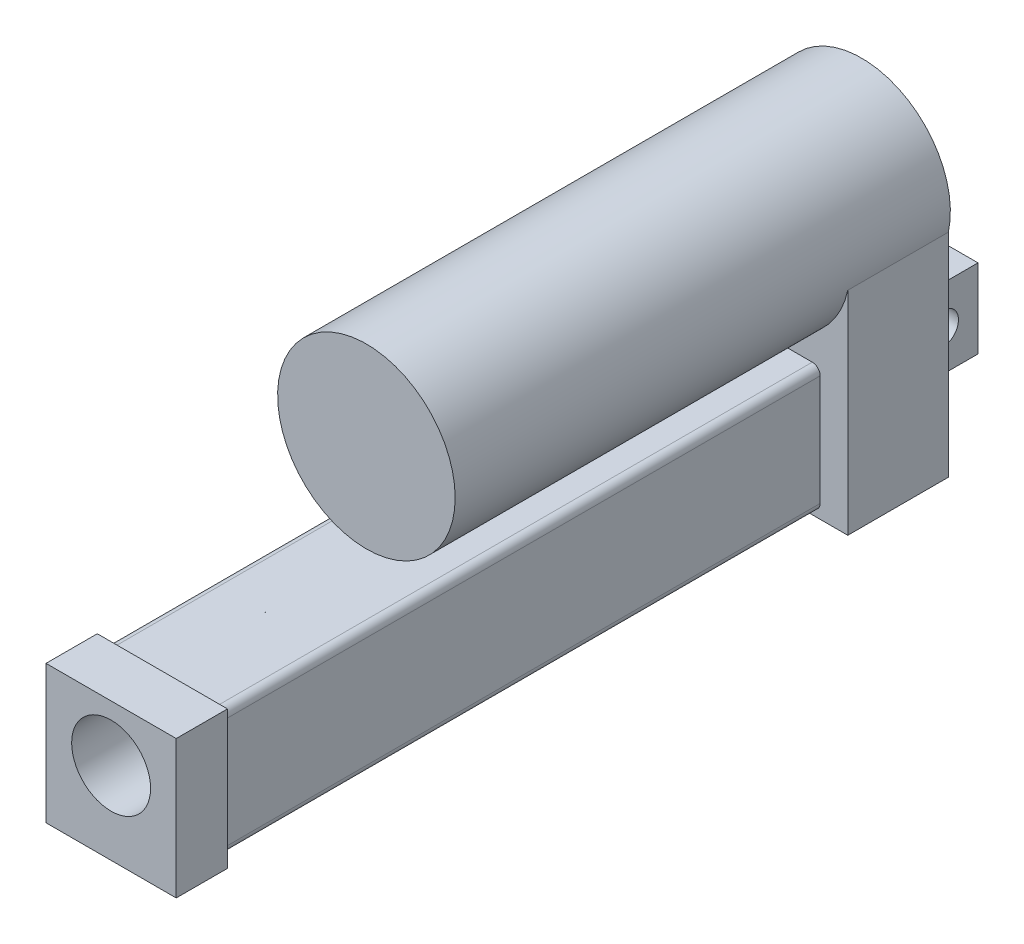
ISO-10303-21;
HEADER;
FILE_DESCRIPTION(('STEP AP214'),'2;1');
FILE_NAME('part.step','',(''),(''),'','','');
FILE_SCHEMA(('AUTOMOTIVE_DESIGN { 1 0 10303 214 1 1 1 1 }'));
ENDSEC;
DATA;
#1=APPLICATION_CONTEXT('core data for automotive mechanical design processes');
#2=APPLICATION_PROTOCOL_DEFINITION('international standard','automotive_design',2000,#1);
#3=PRODUCT_CONTEXT('',#1,'mechanical');
#4=PRODUCT('Part','Part','',(#3));
#5=PRODUCT_RELATED_PRODUCT_CATEGORY('part','',(#4));
#6=PRODUCT_DEFINITION_FORMATION('','',#4);
#7=PRODUCT_DEFINITION_CONTEXT('part definition',#1,'design');
#8=PRODUCT_DEFINITION('design','',#6,#7);
#9=PRODUCT_DEFINITION_SHAPE('','',#8);
#10=(LENGTH_UNIT() NAMED_UNIT(*) SI_UNIT(.MILLI.,.METRE.));
#11=(NAMED_UNIT(*) PLANE_ANGLE_UNIT() SI_UNIT($,.RADIAN.));
#12=(NAMED_UNIT(*) SI_UNIT($,.STERADIAN.) SOLID_ANGLE_UNIT());
#13=UNCERTAINTY_MEASURE_WITH_UNIT(LENGTH_MEASURE(1.E-05),#10,'distance_accuracy_value','');
#14=(GEOMETRIC_REPRESENTATION_CONTEXT(3) GLOBAL_UNCERTAINTY_ASSIGNED_CONTEXT((#13)) GLOBAL_UNIT_ASSIGNED_CONTEXT((#10,
#11,#12)) REPRESENTATION_CONTEXT('',''));
#15=CARTESIAN_POINT('',(0.,0.,0.));
#16=DIRECTION('',(0.,0.,1.));
#17=DIRECTION('',(1.,0.,0.));
#18=AXIS2_PLACEMENT_3D('',#15,#16,#17);
#19=CARTESIAN_POINT('',(15.,-57.,190.2));
#20=DIRECTION('',(-1.,0.,0.));
#21=DIRECTION('',(0.,-1.,0.));
#22=AXIS2_PLACEMENT_3D('',#19,#20,#21);
#23=PLANE('',#22);
#24=DIRECTION('',(0.,1.,0.));
#25=VECTOR('',#24,1.);
#26=CARTESIAN_POINT('',(15.,-57.,177.2));
#27=LINE('',#26,#25);
#28=CARTESIAN_POINT('',(15.,-55.,177.2));
#29=VERTEX_POINT('',#28);
#30=CARTESIAN_POINT('',(15.,-27.,177.2));
#31=VERTEX_POINT('',#30);
#32=EDGE_CURVE('E226',#29,#31,#27,.T.);
#33=ORIENTED_EDGE('',*,*,#32,.F.);
#34=DIRECTION('',(0.,0.,-1.));
#35=VECTOR('',#34,1.);
#36=CARTESIAN_POINT('',(15.,-55.,190.2));
#37=LINE('',#36,#35);
#38=CARTESIAN_POINT('',(15.,-55.,25.5));
#39=VERTEX_POINT('',#38);
#40=EDGE_CURVE('E327',#29,#39,#37,.T.);
#41=ORIENTED_EDGE('',*,*,#40,.T.);
#42=DIRECTION('',(0.,1.,0.));
#43=VECTOR('',#42,1.);
#44=CARTESIAN_POINT('',(15.,-57.,25.5));
#45=LINE('',#44,#43);
#46=CARTESIAN_POINT('',(15.,-27.,25.5));
#47=VERTEX_POINT('',#46);
#48=EDGE_CURVE('E268',#39,#47,#45,.T.);
#49=ORIENTED_EDGE('',*,*,#48,.T.);
#50=DIRECTION('',(0.,0.,-1.));
#51=VECTOR('',#50,1.);
#52=CARTESIAN_POINT('',(15.,-27.,190.2));
#53=LINE('',#52,#51);
#54=EDGE_CURVE('E325',#47,#31,#53,.F.);
#55=ORIENTED_EDGE('',*,*,#54,.T.);
#56=EDGE_LOOP('',(#33,#41,#49,#55));
#57=FACE_BOUND('',#56,.T.);
#58=ADVANCED_FACE('F37',(#57),#23,.F.);
#59=CARTESIAN_POINT('',(-15.,-25.,190.2));
#60=DIRECTION('',(0.,-1.,0.));
#61=DIRECTION('',(0.,0.,-1.));
#62=AXIS2_PLACEMENT_3D('',#59,#60,#61);
#63=PLANE('',#62);
#64=DIRECTION('',(-1.,0.,0.));
#65=VECTOR('',#64,1.);
#66=CARTESIAN_POINT('',(-15.,-25.,25.5));
#67=LINE('',#66,#65);
#68=CARTESIAN_POINT('',(13.,-25.,25.5));
#69=VERTEX_POINT('',#68);
#70=CARTESIAN_POINT('',(-13.,-25.,25.5));
#71=VERTEX_POINT('',#70);
#72=EDGE_CURVE('E271',#69,#71,#67,.T.);
#73=ORIENTED_EDGE('',*,*,#72,.T.);
#74=DIRECTION('',(0.,0.,-1.));
#75=VECTOR('',#74,1.);
#76=CARTESIAN_POINT('',(-13.,-25.,190.2));
#77=LINE('',#76,#75);
#78=CARTESIAN_POINT('',(-13.,-25.,177.2));
#79=VERTEX_POINT('',#78);
#80=EDGE_CURVE('E332',#71,#79,#77,.F.);
#81=ORIENTED_EDGE('',*,*,#80,.T.);
#82=DIRECTION('',(-1.,0.,0.));
#83=VECTOR('',#82,1.);
#84=CARTESIAN_POINT('',(-15.,-25.,177.2));
#85=LINE('',#84,#83);
#86=CARTESIAN_POINT('',(13.,-25.,177.2));
#87=VERTEX_POINT('',#86);
#88=EDGE_CURVE('E223',#87,#79,#85,.T.);
#89=ORIENTED_EDGE('',*,*,#88,.F.);
#90=DIRECTION('',(0.,0.,-1.));
#91=VECTOR('',#90,1.);
#92=CARTESIAN_POINT('',(13.,-25.,190.2));
#93=LINE('',#92,#91);
#94=EDGE_CURVE('E330',#87,#69,#93,.T.);
#95=ORIENTED_EDGE('',*,*,#94,.T.);
#96=EDGE_LOOP('',(#73,#81,#89,#95));
#97=FACE_BOUND('',#96,.T.);
#98=ADVANCED_FACE('F353',(#97),#63,.F.);
#99=CARTESIAN_POINT('',(-15.,-57.,190.2));
#100=DIRECTION('',(1.,0.,0.));
#101=DIRECTION('',(0.,0.,-1.));
#102=AXIS2_PLACEMENT_3D('',#99,#100,#101);
#103=PLANE('',#102);
#104=DIRECTION('',(0.,-1.,0.));
#105=VECTOR('',#104,1.);
#106=CARTESIAN_POINT('',(-15.,-57.,25.5));
#107=LINE('',#106,#105);
#108=CARTESIAN_POINT('',(-15.,-27.,25.5));
#109=VERTEX_POINT('',#108);
#110=CARTESIAN_POINT('',(-15.,-55.,25.5));
#111=VERTEX_POINT('',#110);
#112=EDGE_CURVE('E273',#109,#111,#107,.T.);
#113=ORIENTED_EDGE('',*,*,#112,.T.);
#114=DIRECTION('',(0.,0.,-1.));
#115=VECTOR('',#114,1.);
#116=CARTESIAN_POINT('',(-15.,-55.,190.2));
#117=LINE('',#116,#115);
#118=CARTESIAN_POINT('',(-15.,-55.,177.2));
#119=VERTEX_POINT('',#118);
#120=EDGE_CURVE('E323',#111,#119,#117,.F.);
#121=ORIENTED_EDGE('',*,*,#120,.T.);
#122=DIRECTION('',(0.,-1.,0.));
#123=VECTOR('',#122,1.);
#124=CARTESIAN_POINT('',(-15.,-57.,177.2));
#125=LINE('',#124,#123);
#126=CARTESIAN_POINT('',(-15.,-27.,177.2));
#127=VERTEX_POINT('',#126);
#128=EDGE_CURVE('E217',#127,#119,#125,.T.);
#129=ORIENTED_EDGE('',*,*,#128,.F.);
#130=DIRECTION('',(0.,0.,-1.));
#131=VECTOR('',#130,1.);
#132=CARTESIAN_POINT('',(-15.,-27.,190.2));
#133=LINE('',#132,#131);
#134=EDGE_CURVE('E320',#127,#109,#133,.T.);
#135=ORIENTED_EDGE('',*,*,#134,.T.);
#136=EDGE_LOOP('',(#113,#121,#129,#135));
#137=FACE_BOUND('',#136,.T.);
#138=ADVANCED_FACE('F361',(#137),#103,.F.);
#139=CARTESIAN_POINT('',(-15.,-57.,190.2));
#140=DIRECTION('',(0.,1.,0.));
#141=DIRECTION('',(0.,0.,1.));
#142=AXIS2_PLACEMENT_3D('',#139,#140,#141);
#143=PLANE('',#142);
#144=DIRECTION('',(1.,0.,0.));
#145=VECTOR('',#144,1.);
#146=CARTESIAN_POINT('',(-15.,-57.,177.2));
#147=LINE('',#146,#145);
#148=CARTESIAN_POINT('',(-13.,-57.,177.2));
#149=VERTEX_POINT('',#148);
#150=CARTESIAN_POINT('',(13.,-57.,177.2));
#151=VERTEX_POINT('',#150);
#152=EDGE_CURVE('E312',#149,#151,#147,.T.);
#153=ORIENTED_EDGE('',*,*,#152,.F.);
#154=DIRECTION('',(0.,0.,-1.));
#155=VECTOR('',#154,1.);
#156=CARTESIAN_POINT('',(-13.,-57.,190.2));
#157=LINE('',#156,#155);
#158=CARTESIAN_POINT('',(-13.,-57.,25.5));
#159=VERTEX_POINT('',#158);
#160=EDGE_CURVE('E317',#149,#159,#157,.T.);
#161=ORIENTED_EDGE('',*,*,#160,.T.);
#162=DIRECTION('',(1.,0.,0.));
#163=VECTOR('',#162,1.);
#164=CARTESIAN_POINT('',(-15.,-57.,25.5));
#165=LINE('',#164,#163);
#166=CARTESIAN_POINT('',(13.,-57.,25.5));
#167=VERTEX_POINT('',#166);
#168=EDGE_CURVE('E276',#159,#167,#165,.T.);
#169=ORIENTED_EDGE('',*,*,#168,.T.);
#170=DIRECTION('',(0.,0.,-1.));
#171=VECTOR('',#170,1.);
#172=CARTESIAN_POINT('',(13.,-57.,190.2));
#173=LINE('',#172,#171);
#174=EDGE_CURVE('E315',#167,#151,#173,.F.);
#175=ORIENTED_EDGE('',*,*,#174,.T.);
#176=EDGE_LOOP('',(#153,#161,#169,#175));
#177=FACE_BOUND('',#176,.T.);
#178=ADVANCED_FACE('F369',(#177),#143,.F.);
#179=CARTESIAN_POINT('',(0.,0.,0.));
#180=DIRECTION('',(0.,0.,1.));
#181=DIRECTION('',(1.,0.,0.));
#182=AXIS2_PLACEMENT_3D('',#179,#180,#181);
#183=PLANE('',#182);
#184=CARTESIAN_POINT('',(0.,0.,0.));
#185=DIRECTION('',(0.,0.,1.));
#186=DIRECTION('',(1.,0.,0.));
#187=AXIS2_PLACEMENT_3D('',#184,#185,#186);
#188=CIRCLE('',#187,22.5);
#189=CARTESIAN_POINT('',(22.,-4.71699056602834,0.));
#190=VERTEX_POINT('',#189);
#191=CARTESIAN_POINT('',(-22.,-4.71699056602834,0.));
#192=VERTEX_POINT('',#191);
#193=EDGE_CURVE('E283',#190,#192,#188,.T.);
#194=ORIENTED_EDGE('',*,*,#193,.F.);
#195=DIRECTION('',(0.,1.,0.));
#196=VECTOR('',#195,1.);
#197=CARTESIAN_POINT('',(22.,-58.5,0.));
#198=LINE('',#197,#196);
#199=CARTESIAN_POINT('',(22.,-58.5,0.));
#200=VERTEX_POINT('',#199);
#201=EDGE_CURVE('E289',#200,#190,#198,.T.);
#202=ORIENTED_EDGE('',*,*,#201,.F.);
#203=DIRECTION('',(1.,0.,0.));
#204=VECTOR('',#203,1.);
#205=CARTESIAN_POINT('',(-22.,-58.5,0.));
#206=LINE('',#205,#204);
#207=CARTESIAN_POINT('',(-22.,-58.5,0.));
#208=VERTEX_POINT('',#207);
#209=EDGE_CURVE('E298',#208,#200,#206,.T.);
#210=ORIENTED_EDGE('',*,*,#209,.F.);
#211=DIRECTION('',(0.,-1.,0.));
#212=VECTOR('',#211,1.);
#213=CARTESIAN_POINT('',(-22.,-4.71699056602834,0.));
#214=LINE('',#213,#212);
#215=EDGE_CURVE('E296',#192,#208,#214,.T.);
#216=ORIENTED_EDGE('',*,*,#215,.F.);
#217=EDGE_LOOP('',(#194,#202,#210,#216));
#218=FACE_BOUND('',#217,.T.);
#219=DIRECTION('',(0.,1.,0.));
#220=VECTOR('',#219,1.);
#221=CARTESIAN_POINT('',(-9.50000000000001,-47.7,0.));
#222=LINE('',#221,#220);
#223=CARTESIAN_POINT('',(-9.50000000000001,-47.7,0.));
#224=VERTEX_POINT('',#223);
#225=CARTESIAN_POINT('',(-9.50000000000001,-27.7,0.));
#226=VERTEX_POINT('',#225);
#227=EDGE_CURVE('E235',#224,#226,#222,.T.);
#228=ORIENTED_EDGE('',*,*,#227,.F.);
#229=DIRECTION('',(-1.,0.,0.));
#230=VECTOR('',#229,1.);
#231=CARTESIAN_POINT('',(9.49999999999999,-47.7,0.));
#232=LINE('',#231,#230);
#233=CARTESIAN_POINT('',(9.49999999999999,-47.7,0.));
#234=VERTEX_POINT('',#233);
#235=EDGE_CURVE('E240',#234,#224,#232,.T.);
#236=ORIENTED_EDGE('',*,*,#235,.F.);
#237=DIRECTION('',(0.,-1.,0.));
#238=VECTOR('',#237,1.);
#239=CARTESIAN_POINT('',(9.49999999999999,-47.7,0.));
#240=LINE('',#239,#238);
#241=CARTESIAN_POINT('',(9.49999999999999,-27.7,0.));
#242=VERTEX_POINT('',#241);
#243=EDGE_CURVE('E252',#242,#234,#240,.T.);
#244=ORIENTED_EDGE('',*,*,#243,.F.);
#245=DIRECTION('',(1.,0.,0.));
#246=VECTOR('',#245,1.);
#247=CARTESIAN_POINT('',(9.49999999999999,-27.7,0.));
#248=LINE('',#247,#246);
#249=EDGE_CURVE('E249',#226,#242,#248,.T.);
#250=ORIENTED_EDGE('',*,*,#249,.F.);
#251=EDGE_LOOP('',(#228,#236,#244,#250));
#252=FACE_BOUND('',#251,.T.);
#253=ADVANCED_FACE('F399',(#218,#252),#183,.F.);
#254=CARTESIAN_POINT('',(0.,0.,25.5));
#255=DIRECTION('',(0.,0.,1.));
#256=DIRECTION('',(1.,0.,0.));
#257=AXIS2_PLACEMENT_3D('',#254,#255,#256);
#258=PLANE('',#257);
#259=CARTESIAN_POINT('',(0.,0.,25.5));
#260=DIRECTION('',(0.,0.,1.));
#261=DIRECTION('',(1.,0.,0.));
#262=AXIS2_PLACEMENT_3D('',#259,#260,#261);
#263=CIRCLE('',#262,22.5);
#264=CARTESIAN_POINT('',(-22.,-4.71699056602834,25.5));
#265=VERTEX_POINT('',#264);
#266=CARTESIAN_POINT('',(22.,-4.71699056602834,25.5));
#267=VERTEX_POINT('',#266);
#268=EDGE_CURVE('E279',#265,#267,#263,.T.);
#269=ORIENTED_EDGE('',*,*,#268,.F.);
#270=DIRECTION('',(0.,-1.,0.));
#271=VECTOR('',#270,1.);
#272=CARTESIAN_POINT('',(-22.,-4.71699056602834,25.5));
#273=LINE('',#272,#271);
#274=CARTESIAN_POINT('',(-22.,-58.5,25.5));
#275=VERTEX_POINT('',#274);
#276=EDGE_CURVE('E286',#265,#275,#273,.T.);
#277=ORIENTED_EDGE('',*,*,#276,.T.);
#278=DIRECTION('',(1.,0.,0.));
#279=VECTOR('',#278,1.);
#280=CARTESIAN_POINT('',(-22.,-58.5,25.5));
#281=LINE('',#280,#279);
#282=CARTESIAN_POINT('',(22.,-58.5,25.5));
#283=VERTEX_POINT('',#282);
#284=EDGE_CURVE('E288',#275,#283,#281,.T.);
#285=ORIENTED_EDGE('',*,*,#284,.T.);
#286=DIRECTION('',(0.,1.,0.));
#287=VECTOR('',#286,1.);
#288=CARTESIAN_POINT('',(22.,-58.5,25.5));
#289=LINE('',#288,#287);
#290=EDGE_CURVE('E291',#283,#267,#289,.T.);
#291=ORIENTED_EDGE('',*,*,#290,.T.);
#292=EDGE_LOOP('',(#269,#277,#285,#291));
#293=FACE_BOUND('',#292,.T.);
#294=ORIENTED_EDGE('',*,*,#72,.F.);
#295=CARTESIAN_POINT('',(13.,-27.,25.5));
#296=DIRECTION('',(0.,0.,1.));
#297=DIRECTION('',(1.,0.,0.));
#298=AXIS2_PLACEMENT_3D('',#295,#296,#297);
#299=CIRCLE('',#298,2.);
#300=EDGE_CURVE('E45',#69,#47,#299,.F.);
#301=ORIENTED_EDGE('',*,*,#300,.T.);
#302=ORIENTED_EDGE('',*,*,#48,.F.);
#303=CARTESIAN_POINT('',(13.,-55.,25.5));
#304=DIRECTION('',(0.,0.,1.));
#305=DIRECTION('',(1.,0.,0.));
#306=AXIS2_PLACEMENT_3D('',#303,#304,#305);
#307=CIRCLE('',#306,2.);
#308=EDGE_CURVE('E338',#39,#167,#307,.F.);
#309=ORIENTED_EDGE('',*,*,#308,.T.);
#310=ORIENTED_EDGE('',*,*,#168,.F.);
#311=CARTESIAN_POINT('',(-13.,-55.,25.5));
#312=DIRECTION('',(0.,0.,1.));
#313=DIRECTION('',(1.,0.,0.));
#314=AXIS2_PLACEMENT_3D('',#311,#312,#313);
#315=CIRCLE('',#314,2.);
#316=EDGE_CURVE('E334',#159,#111,#315,.F.);
#317=ORIENTED_EDGE('',*,*,#316,.T.);
#318=ORIENTED_EDGE('',*,*,#112,.F.);
#319=CARTESIAN_POINT('',(-13.,-27.,25.5));
#320=DIRECTION('',(0.,0.,1.));
#321=DIRECTION('',(1.,0.,0.));
#322=AXIS2_PLACEMENT_3D('',#319,#320,#321);
#323=CIRCLE('',#322,2.);
#324=EDGE_CURVE('E52',#109,#71,#323,.F.);
#325=ORIENTED_EDGE('',*,*,#324,.T.);
#326=EDGE_LOOP('',(#294,#301,#302,#309,#310,#317,#318,#325));
#327=FACE_BOUND('',#326,.T.);
#328=ADVANCED_FACE('F345',(#293,#327),#258,.T.);
#329=CARTESIAN_POINT('',(0.,0.,25.5));
#330=DIRECTION('',(0.,0.,-1.));
#331=DIRECTION('',(-1.,0.,0.));
#332=AXIS2_PLACEMENT_3D('',#329,#330,#331);
#333=CYLINDRICAL_SURFACE('',#332,22.5);
#334=ORIENTED_EDGE('',*,*,#193,.T.);
#335=DIRECTION('',(0.,0.,-1.));
#336=VECTOR('',#335,1.);
#337=CARTESIAN_POINT('',(-22.,-4.71699056602834,25.5));
#338=LINE('',#337,#336);
#339=EDGE_CURVE('E309',#265,#192,#338,.T.);
#340=ORIENTED_EDGE('',*,*,#339,.F.);
#341=ORIENTED_EDGE('',*,*,#268,.T.);
#342=DIRECTION('',(0.,0.,-1.));
#343=VECTOR('',#342,1.);
#344=CARTESIAN_POINT('',(22.,-4.71699056602834,25.5));
#345=LINE('',#344,#343);
#346=EDGE_CURVE('E293',#267,#190,#345,.T.);
#347=ORIENTED_EDGE('',*,*,#346,.T.);
#348=EDGE_LOOP('',(#334,#340,#341,#347));
#349=FACE_BOUND('',#348,.T.);
#350=CARTESIAN_POINT('',(0.,0.,125.5));
#351=DIRECTION('',(0.,0.,1.));
#352=DIRECTION('',(1.,0.,0.));
#353=AXIS2_PLACEMENT_3D('',#350,#351,#352);
#354=CIRCLE('',#353,22.5);
#355=CARTESIAN_POINT('',(22.5,0.,125.5));
#356=VERTEX_POINT('',#355);
#357=EDGE_CURVE('E280',#356,#356,#354,.T.);
#358=ORIENTED_EDGE('',*,*,#357,.F.);
#359=EDGE_LOOP('',(#358));
#360=FACE_BOUND('',#359,.T.);
#361=ADVANCED_FACE('F398',(#349,#360),#333,.T.);
#362=CARTESIAN_POINT('',(-22.,-4.71699056602834,25.5));
#363=DIRECTION('',(1.,0.,0.));
#364=DIRECTION('',(0.,0.,-1.));
#365=AXIS2_PLACEMENT_3D('',#362,#363,#364);
#366=PLANE('',#365);
#367=ORIENTED_EDGE('',*,*,#215,.T.);
#368=DIRECTION('',(0.,0.,-1.));
#369=VECTOR('',#368,1.);
#370=CARTESIAN_POINT('',(-22.,-58.5,25.5));
#371=LINE('',#370,#369);
#372=EDGE_CURVE('E306',#275,#208,#371,.T.);
#373=ORIENTED_EDGE('',*,*,#372,.F.);
#374=ORIENTED_EDGE('',*,*,#276,.F.);
#375=ORIENTED_EDGE('',*,*,#339,.T.);
#376=EDGE_LOOP('',(#367,#373,#374,#375));
#377=FACE_BOUND('',#376,.T.);
#378=ADVANCED_FACE('F410',(#377),#366,.F.);
#379=CARTESIAN_POINT('',(-22.,-58.5,25.5));
#380=DIRECTION('',(0.,1.,0.));
#381=DIRECTION('',(-1.,0.,0.));
#382=AXIS2_PLACEMENT_3D('',#379,#380,#381);
#383=PLANE('',#382);
#384=ORIENTED_EDGE('',*,*,#209,.T.);
#385=DIRECTION('',(0.,0.,-1.));
#386=VECTOR('',#385,1.);
#387=CARTESIAN_POINT('',(22.,-58.5,25.5));
#388=LINE('',#387,#386);
#389=EDGE_CURVE('E303',#283,#200,#388,.T.);
#390=ORIENTED_EDGE('',*,*,#389,.F.);
#391=ORIENTED_EDGE('',*,*,#284,.F.);
#392=ORIENTED_EDGE('',*,*,#372,.T.);
#393=EDGE_LOOP('',(#384,#390,#391,#392));
#394=FACE_BOUND('',#393,.T.);
#395=ADVANCED_FACE('F406',(#394),#383,.F.);
#396=CARTESIAN_POINT('',(22.,-58.5,25.5));
#397=DIRECTION('',(-1.,0.,0.));
#398=DIRECTION('',(0.,-1.,0.));
#399=AXIS2_PLACEMENT_3D('',#396,#397,#398);
#400=PLANE('',#399);
#401=ORIENTED_EDGE('',*,*,#201,.T.);
#402=ORIENTED_EDGE('',*,*,#346,.F.);
#403=ORIENTED_EDGE('',*,*,#290,.F.);
#404=ORIENTED_EDGE('',*,*,#389,.T.);
#405=EDGE_LOOP('',(#401,#402,#403,#404));
#406=FACE_BOUND('',#405,.T.);
#407=ADVANCED_FACE('F394',(#406),#400,.F.);
#408=CARTESIAN_POINT('',(0.,0.,125.5));
#409=DIRECTION('',(0.,0.,1.));
#410=DIRECTION('',(1.,0.,0.));
#411=AXIS2_PLACEMENT_3D('',#408,#409,#410);
#412=PLANE('',#411);
#413=ORIENTED_EDGE('',*,*,#357,.T.);
#414=EDGE_LOOP('',(#413));
#415=FACE_BOUND('',#414,.T.);
#416=ADVANCED_FACE('F390',(#415),#412,.T.);
#417=CARTESIAN_POINT('',(-9.50000000000001,-47.7,-20.));
#418=DIRECTION('',(1.,0.,0.));
#419=DIRECTION('',(0.,0.,-1.));
#420=AXIS2_PLACEMENT_3D('',#417,#418,#419);
#421=PLANE('',#420);
#422=CARTESIAN_POINT('',(-9.50000000000001,-37.7,-11.));
#423=DIRECTION('',(1.,0.,0.));
#424=DIRECTION('',(0.,0.,-1.));
#425=AXIS2_PLACEMENT_3D('',#422,#423,#424);
#426=CIRCLE('',#425,4.05);
#427=CARTESIAN_POINT('',(-9.50000000000001,-37.7,-15.05));
#428=VERTEX_POINT('',#427);
#429=EDGE_CURVE('E232',#428,#428,#426,.T.);
#430=ORIENTED_EDGE('',*,*,#429,.T.);
#431=EDGE_LOOP('',(#430));
#432=FACE_BOUND('',#431,.T.);
#433=ORIENTED_EDGE('',*,*,#227,.T.);
#434=DIRECTION('',(0.,0.,1.));
#435=VECTOR('',#434,1.);
#436=CARTESIAN_POINT('',(-9.50000000000001,-27.7,-20.));
#437=LINE('',#436,#435);
#438=CARTESIAN_POINT('',(-9.50000000000001,-27.7,-20.));
#439=VERTEX_POINT('',#438);
#440=EDGE_CURVE('E265',#439,#226,#437,.T.);
#441=ORIENTED_EDGE('',*,*,#440,.F.);
#442=DIRECTION('',(0.,1.,0.));
#443=VECTOR('',#442,1.);
#444=CARTESIAN_POINT('',(-9.50000000000001,-47.7,-20.));
#445=LINE('',#444,#443);
#446=CARTESIAN_POINT('',(-9.50000000000001,-47.7,-20.));
#447=VERTEX_POINT('',#446);
#448=EDGE_CURVE('E236',#447,#439,#445,.T.);
#449=ORIENTED_EDGE('',*,*,#448,.F.);
#450=DIRECTION('',(0.,0.,1.));
#451=VECTOR('',#450,1.);
#452=CARTESIAN_POINT('',(-9.50000000000001,-47.7,-20.));
#453=LINE('',#452,#451);
#454=EDGE_CURVE('E246',#447,#224,#453,.T.);
#455=ORIENTED_EDGE('',*,*,#454,.T.);
#456=EDGE_LOOP('',(#433,#441,#449,#455));
#457=FACE_BOUND('',#456,.T.);
#458=ADVANCED_FACE('F393',(#432,#457),#421,.F.);
#459=CARTESIAN_POINT('',(9.49999999999999,-27.7,-20.));
#460=DIRECTION('',(0.,-1.,0.));
#461=DIRECTION('',(0.,0.,-1.));
#462=AXIS2_PLACEMENT_3D('',#459,#460,#461);
#463=PLANE('',#462);
#464=ORIENTED_EDGE('',*,*,#249,.T.);
#465=DIRECTION('',(0.,0.,1.));
#466=VECTOR('',#465,1.);
#467=CARTESIAN_POINT('',(9.49999999999999,-27.7,-20.));
#468=LINE('',#467,#466);
#469=CARTESIAN_POINT('',(9.49999999999999,-27.7,-20.));
#470=VERTEX_POINT('',#469);
#471=EDGE_CURVE('E262',#470,#242,#468,.T.);
#472=ORIENTED_EDGE('',*,*,#471,.F.);
#473=DIRECTION('',(1.,0.,0.));
#474=VECTOR('',#473,1.);
#475=CARTESIAN_POINT('',(9.49999999999999,-27.7,-20.));
#476=LINE('',#475,#474);
#477=EDGE_CURVE('E239',#439,#470,#476,.T.);
#478=ORIENTED_EDGE('',*,*,#477,.F.);
#479=ORIENTED_EDGE('',*,*,#440,.T.);
#480=EDGE_LOOP('',(#464,#472,#478,#479));
#481=FACE_BOUND('',#480,.T.);
#482=ADVANCED_FACE('F447',(#481),#463,.F.);
#483=CARTESIAN_POINT('',(9.49999999999999,-47.7,-20.));
#484=DIRECTION('',(-1.,0.,0.));
#485=DIRECTION('',(0.,0.,1.));
#486=AXIS2_PLACEMENT_3D('',#483,#484,#485);
#487=PLANE('',#486);
#488=CARTESIAN_POINT('',(9.49999999999999,-37.7,-11.));
#489=DIRECTION('',(1.,0.,0.));
#490=DIRECTION('',(0.,0.,-1.));
#491=AXIS2_PLACEMENT_3D('',#488,#489,#490);
#492=CIRCLE('',#491,4.05);
#493=CARTESIAN_POINT('',(9.49999999999999,-37.7,-15.05));
#494=VERTEX_POINT('',#493);
#495=EDGE_CURVE('E229',#494,#494,#492,.T.);
#496=ORIENTED_EDGE('',*,*,#495,.F.);
#497=EDGE_LOOP('',(#496));
#498=FACE_BOUND('',#497,.T.);
#499=ORIENTED_EDGE('',*,*,#243,.T.);
#500=DIRECTION('',(0.,0.,1.));
#501=VECTOR('',#500,1.);
#502=CARTESIAN_POINT('',(9.49999999999999,-47.7,-20.));
#503=LINE('',#502,#501);
#504=CARTESIAN_POINT('',(9.49999999999999,-47.7,-20.));
#505=VERTEX_POINT('',#504);
#506=EDGE_CURVE('E259',#505,#234,#503,.T.);
#507=ORIENTED_EDGE('',*,*,#506,.F.);
#508=DIRECTION('',(0.,-1.,0.));
#509=VECTOR('',#508,1.);
#510=CARTESIAN_POINT('',(9.49999999999999,-47.7,-20.));
#511=LINE('',#510,#509);
#512=EDGE_CURVE('E242',#470,#505,#511,.T.);
#513=ORIENTED_EDGE('',*,*,#512,.F.);
#514=ORIENTED_EDGE('',*,*,#471,.T.);
#515=EDGE_LOOP('',(#499,#507,#513,#514));
#516=FACE_BOUND('',#515,.T.);
#517=ADVANCED_FACE('F445',(#498,#516),#487,.F.);
#518=CARTESIAN_POINT('',(9.49999999999999,-47.7,-20.));
#519=DIRECTION('',(0.,1.,0.));
#520=DIRECTION('',(0.,0.,1.));
#521=AXIS2_PLACEMENT_3D('',#518,#519,#520);
#522=PLANE('',#521);
#523=ORIENTED_EDGE('',*,*,#235,.T.);
#524=ORIENTED_EDGE('',*,*,#454,.F.);
#525=DIRECTION('',(-1.,0.,0.));
#526=VECTOR('',#525,1.);
#527=CARTESIAN_POINT('',(9.49999999999999,-47.7,-20.));
#528=LINE('',#527,#526);
#529=EDGE_CURVE('E244',#505,#447,#528,.T.);
#530=ORIENTED_EDGE('',*,*,#529,.F.);
#531=ORIENTED_EDGE('',*,*,#506,.T.);
#532=EDGE_LOOP('',(#523,#524,#530,#531));
#533=FACE_BOUND('',#532,.T.);
#534=ADVANCED_FACE('F436',(#533),#522,.F.);
#535=CARTESIAN_POINT('',(0.,0.,-20.));
#536=DIRECTION('',(0.,0.,1.));
#537=DIRECTION('',(1.,0.,0.));
#538=AXIS2_PLACEMENT_3D('',#535,#536,#537);
#539=PLANE('',#538);
#540=ORIENTED_EDGE('',*,*,#448,.T.);
#541=ORIENTED_EDGE('',*,*,#477,.T.);
#542=ORIENTED_EDGE('',*,*,#512,.T.);
#543=ORIENTED_EDGE('',*,*,#529,.T.);
#544=EDGE_LOOP('',(#540,#541,#542,#543));
#545=FACE_BOUND('',#544,.T.);
#546=ADVANCED_FACE('F441',(#545),#539,.F.);
#547=CARTESIAN_POINT('',(-22.5,-37.7,-11.));
#548=DIRECTION('',(1.,0.,0.));
#549=DIRECTION('',(0.,0.,-1.));
#550=AXIS2_PLACEMENT_3D('',#547,#548,#549);
#551=CYLINDRICAL_SURFACE('',#550,4.05);
#552=ORIENTED_EDGE('',*,*,#495,.T.);
#553=EDGE_LOOP('',(#552));
#554=FACE_BOUND('',#553,.T.);
#555=ORIENTED_EDGE('',*,*,#429,.F.);
#556=EDGE_LOOP('',(#555));
#557=FACE_BOUND('',#556,.T.);
#558=ADVANCED_FACE('F493',(#554,#557),#551,.F.);
#559=CARTESIAN_POINT('',(0.,0.,177.2));
#560=DIRECTION('',(0.,0.,1.));
#561=DIRECTION('',(1.,0.,0.));
#562=AXIS2_PLACEMENT_3D('',#559,#560,#561);
#563=PLANE('',#562);
#564=DIRECTION('',(1.,0.,0.));
#565=VECTOR('',#564,1.);
#566=CARTESIAN_POINT('',(-16.5,-58.5,177.2));
#567=LINE('',#566,#565);
#568=CARTESIAN_POINT('',(-16.5,-58.5,177.2));
#569=VERTEX_POINT('',#568);
#570=CARTESIAN_POINT('',(16.5,-58.5,177.2));
#571=VERTEX_POINT('',#570);
#572=EDGE_CURVE('E193',#569,#571,#567,.T.);
#573=ORIENTED_EDGE('',*,*,#572,.F.);
#574=DIRECTION('',(0.,-1.,0.));
#575=VECTOR('',#574,1.);
#576=CARTESIAN_POINT('',(-16.5,-23.5,177.2));
#577=LINE('',#576,#575);
#578=CARTESIAN_POINT('',(-16.5,-23.5,177.2));
#579=VERTEX_POINT('',#578);
#580=EDGE_CURVE('E185',#579,#569,#577,.T.);
#581=ORIENTED_EDGE('',*,*,#580,.F.);
#582=DIRECTION('',(-1.,0.,0.));
#583=VECTOR('',#582,1.);
#584=CARTESIAN_POINT('',(16.5,-23.5,177.2));
#585=LINE('',#584,#583);
#586=CARTESIAN_POINT('',(16.5,-23.5,177.2));
#587=VERTEX_POINT('',#586);
#588=EDGE_CURVE('E196',#587,#579,#585,.T.);
#589=ORIENTED_EDGE('',*,*,#588,.F.);
#590=DIRECTION('',(0.,1.,0.));
#591=VECTOR('',#590,1.);
#592=CARTESIAN_POINT('',(16.5,-58.5,177.2));
#593=LINE('',#592,#591);
#594=EDGE_CURVE('E177',#571,#587,#593,.T.);
#595=ORIENTED_EDGE('',*,*,#594,.F.);
#596=EDGE_LOOP('',(#573,#581,#589,#595));
#597=FACE_BOUND('',#596,.T.);
#598=ORIENTED_EDGE('',*,*,#128,.T.);
#599=CARTESIAN_POINT('',(-13.,-55.,177.2));
#600=DIRECTION('',(0.,0.,1.));
#601=DIRECTION('',(1.,0.,0.));
#602=AXIS2_PLACEMENT_3D('',#599,#600,#601);
#603=CIRCLE('',#602,2.);
#604=EDGE_CURVE('E336',#119,#149,#603,.T.);
#605=ORIENTED_EDGE('',*,*,#604,.T.);
#606=ORIENTED_EDGE('',*,*,#152,.T.);
#607=CARTESIAN_POINT('',(13.,-55.,177.2));
#608=DIRECTION('',(0.,0.,1.));
#609=DIRECTION('',(1.,0.,0.));
#610=AXIS2_PLACEMENT_3D('',#607,#608,#609);
#611=CIRCLE('',#610,2.);
#612=EDGE_CURVE('E340',#151,#29,#611,.T.);
#613=ORIENTED_EDGE('',*,*,#612,.T.);
#614=ORIENTED_EDGE('',*,*,#32,.T.);
#615=CARTESIAN_POINT('',(13.,-27.,177.2));
#616=DIRECTION('',(0.,0.,1.));
#617=DIRECTION('',(1.,0.,0.));
#618=AXIS2_PLACEMENT_3D('',#615,#616,#617);
#619=CIRCLE('',#618,2.);
#620=EDGE_CURVE('E11',#31,#87,#619,.T.);
#621=ORIENTED_EDGE('',*,*,#620,.T.);
#622=ORIENTED_EDGE('',*,*,#88,.T.);
#623=CARTESIAN_POINT('',(-13.,-27.,177.2));
#624=DIRECTION('',(0.,0.,1.));
#625=DIRECTION('',(1.,0.,0.));
#626=AXIS2_PLACEMENT_3D('',#623,#624,#625);
#627=CIRCLE('',#626,2.);
#628=EDGE_CURVE('E343',#79,#127,#627,.T.);
#629=ORIENTED_EDGE('',*,*,#628,.T.);
#630=EDGE_LOOP('',(#598,#605,#606,#613,#614,#621,#622,#629));
#631=FACE_BOUND('',#630,.T.);
#632=ADVANCED_FACE('F190',(#597,#631),#563,.F.);
#633=CARTESIAN_POINT('',(-16.5,-58.5,177.2));
#634=DIRECTION('',(0.,-1.,0.));
#635=DIRECTION('',(0.,0.,-1.));
#636=AXIS2_PLACEMENT_3D('',#633,#634,#635);
#637=PLANE('',#636);
#638=DIRECTION('',(1.,0.,0.));
#639=VECTOR('',#638,1.);
#640=CARTESIAN_POINT('',(-16.5,-58.5,190.2));
#641=LINE('',#640,#639);
#642=CARTESIAN_POINT('',(-16.5,-58.5,190.2));
#643=VERTEX_POINT('',#642);
#644=CARTESIAN_POINT('',(16.5,-58.5,190.2));
#645=VERTEX_POINT('',#644);
#646=EDGE_CURVE('E211',#643,#645,#641,.T.);
#647=ORIENTED_EDGE('',*,*,#646,.F.);
#648=DIRECTION('',(0.,0.,1.));
#649=VECTOR('',#648,1.);
#650=CARTESIAN_POINT('',(-16.5,-58.5,177.2));
#651=LINE('',#650,#649);
#652=EDGE_CURVE('E199',#569,#643,#651,.T.);
#653=ORIENTED_EDGE('',*,*,#652,.F.);
#654=ORIENTED_EDGE('',*,*,#572,.T.);
#655=DIRECTION('',(0.,0.,1.));
#656=VECTOR('',#655,1.);
#657=CARTESIAN_POINT('',(16.5,-58.5,177.2));
#658=LINE('',#657,#656);
#659=EDGE_CURVE('E174',#571,#645,#658,.T.);
#660=ORIENTED_EDGE('',*,*,#659,.T.);
#661=EDGE_LOOP('',(#647,#653,#654,#660));
#662=FACE_BOUND('',#661,.T.);
#663=ADVANCED_FACE('F198',(#662),#637,.T.);
#664=CARTESIAN_POINT('',(-16.5,-23.5,177.2));
#665=DIRECTION('',(-1.,0.,0.));
#666=DIRECTION('',(0.,0.,1.));
#667=AXIS2_PLACEMENT_3D('',#664,#665,#666);
#668=PLANE('',#667);
#669=DIRECTION('',(0.,-1.,0.));
#670=VECTOR('',#669,1.);
#671=CARTESIAN_POINT('',(-16.5,-23.5,190.2));
#672=LINE('',#671,#670);
#673=CARTESIAN_POINT('',(-16.5,-23.5,190.2));
#674=VERTEX_POINT('',#673);
#675=EDGE_CURVE('E200',#674,#643,#672,.T.);
#676=ORIENTED_EDGE('',*,*,#675,.F.);
#677=DIRECTION('',(0.,0.,1.));
#678=VECTOR('',#677,1.);
#679=CARTESIAN_POINT('',(-16.5,-23.5,177.2));
#680=LINE('',#679,#678);
#681=EDGE_CURVE('E218',#579,#674,#680,.T.);
#682=ORIENTED_EDGE('',*,*,#681,.F.);
#683=ORIENTED_EDGE('',*,*,#580,.T.);
#684=ORIENTED_EDGE('',*,*,#652,.T.);
#685=EDGE_LOOP('',(#676,#682,#683,#684));
#686=FACE_BOUND('',#685,.T.);
#687=ADVANCED_FACE('F547',(#686),#668,.T.);
#688=CARTESIAN_POINT('',(16.5,-23.5,177.2));
#689=DIRECTION('',(0.,1.,0.));
#690=DIRECTION('',(0.,0.,1.));
#691=AXIS2_PLACEMENT_3D('',#688,#689,#690);
#692=PLANE('',#691);
#693=DIRECTION('',(-1.,0.,0.));
#694=VECTOR('',#693,1.);
#695=CARTESIAN_POINT('',(16.5,-23.5,190.2));
#696=LINE('',#695,#694);
#697=CARTESIAN_POINT('',(16.5,-23.5,190.2));
#698=VERTEX_POINT('',#697);
#699=EDGE_CURVE('E203',#698,#674,#696,.T.);
#700=ORIENTED_EDGE('',*,*,#699,.F.);
#701=DIRECTION('',(0.,0.,1.));
#702=VECTOR('',#701,1.);
#703=CARTESIAN_POINT('',(16.5,-23.5,177.2));
#704=LINE('',#703,#702);
#705=EDGE_CURVE('E184',#587,#698,#704,.T.);
#706=ORIENTED_EDGE('',*,*,#705,.F.);
#707=ORIENTED_EDGE('',*,*,#588,.T.);
#708=ORIENTED_EDGE('',*,*,#681,.T.);
#709=EDGE_LOOP('',(#700,#706,#707,#708));
#710=FACE_BOUND('',#709,.T.);
#711=ADVANCED_FACE('F550',(#710),#692,.T.);
#712=CARTESIAN_POINT('',(16.5,-58.5,177.2));
#713=DIRECTION('',(1.,0.,0.));
#714=DIRECTION('',(0.,1.,0.));
#715=AXIS2_PLACEMENT_3D('',#712,#713,#714);
#716=PLANE('',#715);
#717=DIRECTION('',(0.,1.,0.));
#718=VECTOR('',#717,1.);
#719=CARTESIAN_POINT('',(16.5,-58.5,190.2));
#720=LINE('',#719,#718);
#721=EDGE_CURVE('E179',#645,#698,#720,.T.);
#722=ORIENTED_EDGE('',*,*,#721,.F.);
#723=ORIENTED_EDGE('',*,*,#659,.F.);
#724=ORIENTED_EDGE('',*,*,#594,.T.);
#725=ORIENTED_EDGE('',*,*,#705,.T.);
#726=EDGE_LOOP('',(#722,#723,#724,#725));
#727=FACE_BOUND('',#726,.T.);
#728=ADVANCED_FACE('F176',(#727),#716,.T.);
#729=CARTESIAN_POINT('',(0.,0.,190.2));
#730=DIRECTION('',(0.,0.,-1.));
#731=DIRECTION('',(-1.,0.,0.));
#732=AXIS2_PLACEMENT_3D('',#729,#730,#731);
#733=PLANE('',#732);
#734=CARTESIAN_POINT('',(0.,-37.7,190.2));
#735=DIRECTION('',(0.,0.,-1.));
#736=DIRECTION('',(-1.,0.,0.));
#737=AXIS2_PLACEMENT_3D('',#734,#735,#736);
#738=CIRCLE('',#737,10.);
#739=CARTESIAN_POINT('',(-10.,-37.7,190.2));
#740=VERTEX_POINT('',#739);
#741=EDGE_CURVE('E206',#740,#740,#738,.T.);
#742=ORIENTED_EDGE('',*,*,#741,.T.);
#743=EDGE_LOOP('',(#742));
#744=FACE_BOUND('',#743,.T.);
#745=ORIENTED_EDGE('',*,*,#646,.T.);
#746=ORIENTED_EDGE('',*,*,#721,.T.);
#747=ORIENTED_EDGE('',*,*,#699,.T.);
#748=ORIENTED_EDGE('',*,*,#675,.T.);
#749=EDGE_LOOP('',(#745,#746,#747,#748));
#750=FACE_BOUND('',#749,.T.);
#751=ADVANCED_FACE('F380',(#744,#750),#733,.F.);
#752=CARTESIAN_POINT('',(-13.,-55.,190.2));
#753=DIRECTION('',(0.,0.,-1.));
#754=DIRECTION('',(-1.,0.,0.));
#755=AXIS2_PLACEMENT_3D('',#752,#753,#754);
#756=CYLINDRICAL_SURFACE('',#755,2.);
#757=ORIENTED_EDGE('',*,*,#604,.F.);
#758=ORIENTED_EDGE('',*,*,#120,.F.);
#759=ORIENTED_EDGE('',*,*,#316,.F.);
#760=ORIENTED_EDGE('',*,*,#160,.F.);
#761=EDGE_LOOP('',(#757,#758,#759,#760));
#762=FACE_BOUND('',#761,.T.);
#763=ADVANCED_FACE('F364',(#762),#756,.T.);
#764=CARTESIAN_POINT('',(13.,-55.,190.2));
#765=DIRECTION('',(0.,0.,-1.));
#766=DIRECTION('',(-1.,0.,0.));
#767=AXIS2_PLACEMENT_3D('',#764,#765,#766);
#768=CYLINDRICAL_SURFACE('',#767,2.);
#769=ORIENTED_EDGE('',*,*,#612,.F.);
#770=ORIENTED_EDGE('',*,*,#174,.F.);
#771=ORIENTED_EDGE('',*,*,#308,.F.);
#772=ORIENTED_EDGE('',*,*,#40,.F.);
#773=EDGE_LOOP('',(#769,#770,#771,#772));
#774=FACE_BOUND('',#773,.T.);
#775=ADVANCED_FACE('F373',(#774),#768,.T.);
#776=CARTESIAN_POINT('',(-13.,-27.,190.2));
#777=DIRECTION('',(0.,0.,-1.));
#778=DIRECTION('',(-1.,0.,0.));
#779=AXIS2_PLACEMENT_3D('',#776,#777,#778);
#780=CYLINDRICAL_SURFACE('',#779,2.);
#781=ORIENTED_EDGE('',*,*,#628,.F.);
#782=ORIENTED_EDGE('',*,*,#80,.F.);
#783=ORIENTED_EDGE('',*,*,#324,.F.);
#784=ORIENTED_EDGE('',*,*,#134,.F.);
#785=EDGE_LOOP('',(#781,#782,#783,#784));
#786=FACE_BOUND('',#785,.T.);
#787=ADVANCED_FACE('F356',(#786),#780,.T.);
#788=CARTESIAN_POINT('',(13.,-27.,190.2));
#789=DIRECTION('',(0.,0.,-1.));
#790=DIRECTION('',(-1.,0.,0.));
#791=AXIS2_PLACEMENT_3D('',#788,#789,#790);
#792=CYLINDRICAL_SURFACE('',#791,2.);
#793=ORIENTED_EDGE('',*,*,#620,.F.);
#794=ORIENTED_EDGE('',*,*,#54,.F.);
#795=ORIENTED_EDGE('',*,*,#300,.F.);
#796=ORIENTED_EDGE('',*,*,#94,.F.);
#797=EDGE_LOOP('',(#793,#794,#795,#796));
#798=FACE_BOUND('',#797,.T.);
#799=ADVANCED_FACE('F39',(#798),#792,.T.);
#800=CARTESIAN_POINT('',(0.,-37.7,115.2));
#801=DIRECTION('',(0.,0.,1.));
#802=DIRECTION('',(1.,0.,0.));
#803=AXIS2_PLACEMENT_3D('',#800,#801,#802);
#804=CYLINDRICAL_SURFACE('',#803,10.);
#805=CARTESIAN_POINT('',(0.,-37.7,115.2));
#806=DIRECTION('',(0.,0.,1.));
#807=DIRECTION('',(1.,0.,0.));
#808=AXIS2_PLACEMENT_3D('',#805,#806,#807);
#809=CIRCLE('',#808,10.);
#810=CARTESIAN_POINT('',(10.,-37.7,115.2));
#811=VERTEX_POINT('',#810);
#812=EDGE_CURVE('E675',#811,#811,#809,.T.);
#813=ORIENTED_EDGE('',*,*,#812,.F.);
#814=EDGE_LOOP('',(#813));
#815=FACE_BOUND('',#814,.T.);
#816=ORIENTED_EDGE('',*,*,#741,.F.);
#817=EDGE_LOOP('',(#816));
#818=FACE_BOUND('',#817,.T.);
#819=ADVANCED_FACE('F523',(#815,#818),#804,.F.);
#820=CARTESIAN_POINT('',(0.,-37.7,115.2));
#821=DIRECTION('',(0.,0.,1.));
#822=DIRECTION('',(1.,0.,0.));
#823=AXIS2_PLACEMENT_3D('',#820,#821,#822);
#824=PLANE('',#823);
#825=ORIENTED_EDGE('',*,*,#812,.T.);
#826=EDGE_LOOP('',(#825));
#827=FACE_BOUND('',#826,.T.);
#828=ADVANCED_FACE('F531',(#827),#824,.T.);
#829=CLOSED_SHELL('',(#58,#98,#138,#178,#253,#328,#361,#378,#395,#407,#416,#458,#482,#517,#534,
#546,#558,#632,#663,#687,#711,#728,#751,#763,#775,#787,#799,#819,#828));
#830=MANIFOLD_SOLID_BREP('B2',#829);
#831=ADVANCED_BREP_SHAPE_REPRESENTATION('',(#18,#830),#14);
#832=SHAPE_DEFINITION_REPRESENTATION(#9,#831);
ENDSEC;
END-ISO-10303-21;
